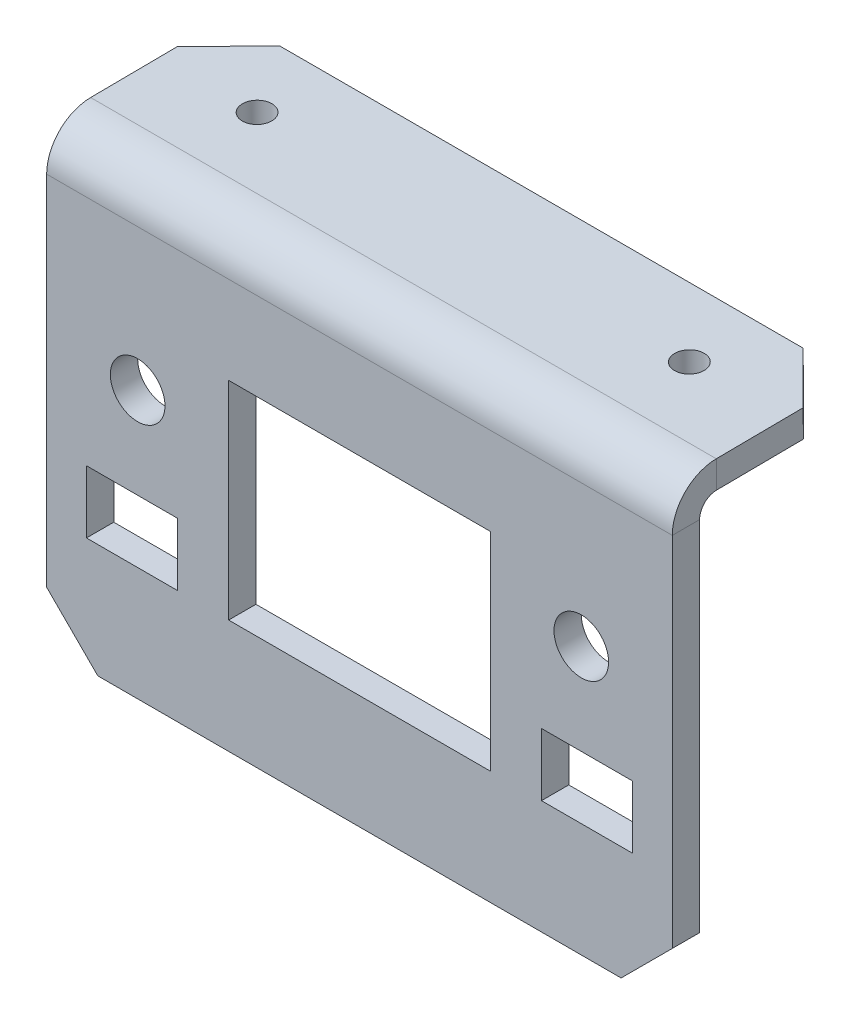
ISO-10303-21;
HEADER;
FILE_DESCRIPTION(('STEP AP214'),'2;1');
FILE_NAME('part.step','',(''),(''),'','','');
FILE_SCHEMA(('AUTOMOTIVE_DESIGN { 1 0 10303 214 1 1 1 1 }'));
ENDSEC;
DATA;
#1=APPLICATION_CONTEXT('core data for automotive mechanical design processes');
#2=APPLICATION_PROTOCOL_DEFINITION('international standard','automotive_design',2000,#1);
#3=PRODUCT_CONTEXT('',#1,'mechanical');
#4=PRODUCT('Part','Part','',(#3));
#5=PRODUCT_RELATED_PRODUCT_CATEGORY('part','',(#4));
#6=PRODUCT_DEFINITION_FORMATION('','',#4);
#7=PRODUCT_DEFINITION_CONTEXT('part definition',#1,'design');
#8=PRODUCT_DEFINITION('design','',#6,#7);
#9=PRODUCT_DEFINITION_SHAPE('','',#8);
#10=(LENGTH_UNIT() NAMED_UNIT(*) SI_UNIT(.MILLI.,.METRE.));
#11=(NAMED_UNIT(*) PLANE_ANGLE_UNIT() SI_UNIT($,.RADIAN.));
#12=(NAMED_UNIT(*) SI_UNIT($,.STERADIAN.) SOLID_ANGLE_UNIT());
#13=UNCERTAINTY_MEASURE_WITH_UNIT(LENGTH_MEASURE(1.E-05),#10,'distance_accuracy_value','');
#14=(GEOMETRIC_REPRESENTATION_CONTEXT(3) GLOBAL_UNCERTAINTY_ASSIGNED_CONTEXT((#13)) GLOBAL_UNIT_ASSIGNED_CONTEXT((#10,
#11,#12)) REPRESENTATION_CONTEXT('',''));
#15=CARTESIAN_POINT('',(0.,0.,0.));
#16=DIRECTION('',(0.,0.,1.));
#17=DIRECTION('',(1.,0.,0.));
#18=AXIS2_PLACEMENT_3D('',#15,#16,#17);
#19=CARTESIAN_POINT('',(0.,8.35779949302623,-8.128));
#20=DIRECTION('',(0.,0.00872653549837395,-0.999961923064171));
#21=DIRECTION('',(-1.,0.,0.));
#22=AXIS2_PLACEMENT_3D('',#19,#20,#21);
#23=PLANE('',#22);
#24=DIRECTION('',(1.,0.,0.));
#25=VECTOR('',#24,1.);
#26=CARTESIAN_POINT('',(0.,7.13864591642639,-8.13863939207961));
#27=LINE('',#26,#25);
#28=CARTESIAN_POINT('',(11.6836904988808,7.13864591642639,-8.13863939207961));
#29=VERTEX_POINT('',#28);
#30=CARTESIAN_POINT('',(-11.6836904988808,7.13864591642639,-8.13863939207961));
#31=VERTEX_POINT('',#30);
#32=EDGE_CURVE('E366',#29,#31,#27,.F.);
#33=ORIENTED_EDGE('',*,*,#32,.T.);
#34=DIRECTION('',(0.,0.999961923064171,0.00872653549837395));
#35=VECTOR('',#34,1.);
#36=CARTESIAN_POINT('',(-11.6836904988808,8.35779949302612,-8.128));
#37=LINE('',#36,#35);
#38=CARTESIAN_POINT('',(-11.6836904988808,8.35779949302612,-8.128));
#39=VERTEX_POINT('',#38);
#40=EDGE_CURVE('E279',#39,#31,#37,.F.);
#41=ORIENTED_EDGE('',*,*,#40,.F.);
#42=DIRECTION('',(-1.,0.,0.));
#43=VECTOR('',#42,1.);
#44=CARTESIAN_POINT('',(0.,8.35779949302623,-8.128));
#45=LINE('',#44,#43);
#46=CARTESIAN_POINT('',(11.6836904988808,8.35779949302623,-8.128));
#47=VERTEX_POINT('',#46);
#48=EDGE_CURVE('E341',#47,#39,#45,.T.);
#49=ORIENTED_EDGE('',*,*,#48,.F.);
#50=DIRECTION('',(0.,-0.999961923064171,-0.00872653549837395));
#51=VECTOR('',#50,1.);
#52=CARTESIAN_POINT('',(11.6836904988808,7.13864591642639,-8.13863939207961));
#53=LINE('',#52,#51);
#54=EDGE_CURVE('E320',#29,#47,#53,.F.);
#55=ORIENTED_EDGE('',*,*,#54,.F.);
#56=EDGE_LOOP('',(#33,#41,#49,#55));
#57=FACE_BOUND('',#56,.T.);
#58=ADVANCED_FACE('F49',(#57),#23,.T.);
#59=CARTESIAN_POINT('',(0.,8.3312,-5.08));
#60=DIRECTION('',(0.,0.999961923064171,0.00872653549837395));
#61=DIRECTION('',(0.,-0.00872653549837395,0.999961923064171));
#62=AXIS2_PLACEMENT_3D('',#59,#60,#61);
#63=PLANE('',#62);
#64=ORIENTED_EDGE('',*,*,#48,.T.);
#65=DIRECTION('',(0.707106781186545,0.00617059242716529,-0.707079856727018));
#66=VECTOR('',#65,1.);
#67=CARTESIAN_POINT('',(-9.88763927466694,8.37347279779112,-9.92398283608662));
#68=LINE('',#67,#66);
#69=CARTESIAN_POINT('',(-13.97,8.33784793200444,-5.8417775545409));
#70=VERTEX_POINT('',#69);
#71=EDGE_CURVE('E284',#70,#39,#68,.T.);
#72=ORIENTED_EDGE('',*,*,#71,.F.);
#73=DIRECTION('',(0.,-0.00872653549837395,0.999961923064171));
#74=VECTOR('',#73,1.);
#75=CARTESIAN_POINT('',(-13.97,8.33119999999999,-5.08));
#76=LINE('',#75,#74);
#77=CARTESIAN_POINT('',(-13.97,8.3040063031669,-1.96391098787062));
#78=VERTEX_POINT('',#77);
#79=EDGE_CURVE('E344',#70,#78,#76,.T.);
#80=ORIENTED_EDGE('',*,*,#79,.T.);
#81=DIRECTION('',(-1.,0.,0.));
#82=VECTOR('',#81,1.);
#83=CARTESIAN_POINT('',(13.97,8.30400630316691,-1.96391098787062));
#84=LINE('',#83,#82);
#85=CARTESIAN_POINT('',(13.97,8.30400630316691,-1.96391098787062));
#86=VERTEX_POINT('',#85);
#87=EDGE_CURVE('E349',#78,#86,#84,.F.);
#88=ORIENTED_EDGE('',*,*,#87,.T.);
#89=DIRECTION('',(0.,-0.00872653549837395,0.999961923064171));
#90=VECTOR('',#89,1.);
#91=CARTESIAN_POINT('',(13.97,8.35779746741042,-8.12776788741834));
#92=LINE('',#91,#90);
#93=CARTESIAN_POINT('',(13.97,8.33784793200444,-5.8417775545409));
#94=VERTEX_POINT('',#93);
#95=EDGE_CURVE('E339',#94,#86,#92,.T.);
#96=ORIENTED_EDGE('',*,*,#95,.F.);
#97=DIRECTION('',(-0.707106781186545,0.00617059242716528,-0.707079856727018));
#98=VECTOR('',#97,1.);
#99=CARTESIAN_POINT('',(7.36590328090028,8.39547881645836,-12.4456228098737));
#100=LINE('',#99,#98);
#101=EDGE_CURVE('E321',#94,#47,#100,.T.);
#102=ORIENTED_EDGE('',*,*,#101,.T.);
#103=EDGE_LOOP('',(#64,#72,#80,#88,#96,#102));
#104=FACE_BOUND('',#103,.T.);
#105=CARTESIAN_POINT('',(9.652,8.33119831195457,-5.079806569166));
#106=DIRECTION('',(0.,-0.999961923064171,-0.00872653549837395));
#107=DIRECTION('',(0.,0.00872653549837395,-0.999961923064171));
#108=AXIS2_PLACEMENT_3D('',#105,#106,#107);
#109=CIRCLE('',#108,0.6604);
#110=CARTESIAN_POINT('',(9.652,8.3369613159977,-5.74018142315758));
#111=VERTEX_POINT('',#110);
#112=EDGE_CURVE('E317',#111,#111,#109,.T.);
#113=ORIENTED_EDGE('',*,*,#112,.T.);
#114=EDGE_LOOP('',(#113));
#115=FACE_BOUND('',#114,.T.);
#116=CARTESIAN_POINT('',(-9.652,8.33119831195457,-5.079806569166));
#117=DIRECTION('',(0.,0.999961923064171,0.00872653549837395));
#118=DIRECTION('',(0.,0.00872653549837395,-0.999961923064171));
#119=AXIS2_PLACEMENT_3D('',#116,#117,#118);
#120=CIRCLE('',#119,0.6604);
#121=CARTESIAN_POINT('',(-9.652,8.3369613159977,-5.74018142315758));
#122=VERTEX_POINT('',#121);
#123=EDGE_CURVE('E276',#122,#122,#120,.T.);
#124=ORIENTED_EDGE('',*,*,#123,.F.);
#125=EDGE_LOOP('',(#124));
#126=FACE_BOUND('',#125,.T.);
#127=ADVANCED_FACE('F469',(#104,#115,#126),#63,.T.);
#128=CARTESIAN_POINT('',(0.,7.11204642340016,-5.09063939207962));
#129=DIRECTION('',(0.,0.999961923064171,0.00872653549837395));
#130=DIRECTION('',(0.,-0.00872653549837395,0.999961923064171));
#131=AXIS2_PLACEMENT_3D('',#128,#129,#130);
#132=PLANE('',#131);
#133=CARTESIAN_POINT('',(9.652,7.11204473535474,-5.09044596124562));
#134=DIRECTION('',(0.,-0.999961923064171,-0.00872653549837395));
#135=DIRECTION('',(0.,0.00872653549837395,-0.999961923064171));
#136=AXIS2_PLACEMENT_3D('',#133,#134,#135);
#137=CIRCLE('',#136,0.6604);
#138=CARTESIAN_POINT('',(9.652,7.11780773939786,-5.7508208152372));
#139=VERTEX_POINT('',#138);
#140=EDGE_CURVE('E313',#139,#139,#137,.T.);
#141=ORIENTED_EDGE('',*,*,#140,.F.);
#142=EDGE_LOOP('',(#141));
#143=FACE_BOUND('',#142,.T.);
#144=DIRECTION('',(0.707106781186545,0.00617059242716529,-0.707079856727018));
#145=VECTOR('',#144,1.);
#146=CARTESIAN_POINT('',(-9.88763927466694,7.15431922119128,-9.93462222816624));
#147=LINE('',#146,#145);
#148=CARTESIAN_POINT('',(-13.97,7.1186943554046,-5.85241694662052));
#149=VERTEX_POINT('',#148);
#150=EDGE_CURVE('E280',#149,#31,#147,.T.);
#151=ORIENTED_EDGE('',*,*,#150,.T.);
#152=ORIENTED_EDGE('',*,*,#32,.F.);
#153=DIRECTION('',(-0.707106781186545,0.00617059242716528,-0.707079856727018));
#154=VECTOR('',#153,1.);
#155=CARTESIAN_POINT('',(7.36590328090028,7.17632523985852,-12.4562622019533));
#156=LINE('',#155,#154);
#157=CARTESIAN_POINT('',(13.97,7.1186943554046,-5.85241694662052));
#158=VERTEX_POINT('',#157);
#159=EDGE_CURVE('E325',#158,#29,#156,.T.);
#160=ORIENTED_EDGE('',*,*,#159,.F.);
#161=DIRECTION('',(0.,-0.00872653549837395,0.999961923064171));
#162=VECTOR('',#161,1.);
#163=CARTESIAN_POINT('',(13.97,7.11204642340016,-5.09063939207962));
#164=LINE('',#163,#162);
#165=CARTESIAN_POINT('',(13.97,7.08485272656707,-1.97455037995024));
#166=VERTEX_POINT('',#165);
#167=EDGE_CURVE('E369',#158,#166,#164,.T.);
#168=ORIENTED_EDGE('',*,*,#167,.T.);
#169=DIRECTION('',(1.,0.,0.));
#170=VECTOR('',#169,1.);
#171=CARTESIAN_POINT('',(0.,7.08485272656707,-1.97455037995024));
#172=LINE('',#171,#170);
#173=CARTESIAN_POINT('',(-13.97,7.08485272656707,-1.97455037995024));
#174=VERTEX_POINT('',#173);
#175=EDGE_CURVE('E356',#174,#166,#172,.T.);
#176=ORIENTED_EDGE('',*,*,#175,.F.);
#177=DIRECTION('',(0.,-0.00872653549837395,0.999961923064171));
#178=VECTOR('',#177,1.);
#179=CARTESIAN_POINT('',(-13.97,7.11204642340016,-5.09063939207962));
#180=LINE('',#179,#178);
#181=EDGE_CURVE('E364',#149,#174,#180,.T.);
#182=ORIENTED_EDGE('',*,*,#181,.F.);
#183=EDGE_LOOP('',(#151,#152,#160,#168,#176,#182));
#184=FACE_BOUND('',#183,.T.);
#185=CARTESIAN_POINT('',(-9.652,7.11204473535474,-5.09044596124562));
#186=DIRECTION('',(0.,0.999961923064171,0.00872653549837395));
#187=DIRECTION('',(0.,-0.00872653549837395,0.999961923064171));
#188=AXIS2_PLACEMENT_3D('',#185,#186,#187);
#189=CIRCLE('',#188,0.6604);
#190=CARTESIAN_POINT('',(-9.652,7.10628173131161,-4.43007110725404));
#191=VERTEX_POINT('',#190);
#192=EDGE_CURVE('E272',#191,#191,#189,.T.);
#193=ORIENTED_EDGE('',*,*,#192,.T.);
#194=EDGE_LOOP('',(#193));
#195=FACE_BOUND('',#194,.T.);
#196=ADVANCED_FACE('F475',(#143,#184,#195),#132,.F.);
#197=CARTESIAN_POINT('',(-13.97,8.33119999999999,-5.08));
#198=DIRECTION('',(-1.,0.,0.));
#199=DIRECTION('',(0.,-0.00872653549837395,0.999961923064171));
#200=AXIS2_PLACEMENT_3D('',#197,#198,#199);
#201=PLANE('',#200);
#202=ORIENTED_EDGE('',*,*,#79,.F.);
#203=DIRECTION('',(0.,0.999961923064171,0.00872653549837395));
#204=VECTOR('',#203,1.);
#205=CARTESIAN_POINT('',(-13.97,8.33784793200444,-5.8417775545409));
#206=LINE('',#205,#204);
#207=EDGE_CURVE('E283',#70,#149,#206,.F.);
#208=ORIENTED_EDGE('',*,*,#207,.T.);
#209=ORIENTED_EDGE('',*,*,#181,.T.);
#210=DIRECTION('',(0.,0.999961923064171,0.00872653549837393));
#211=VECTOR('',#210,1.);
#212=CARTESIAN_POINT('',(-13.97,8.3040063031669,-1.96391098787062));
#213=LINE('',#212,#211);
#214=EDGE_CURVE('E352',#174,#78,#213,.T.);
#215=ORIENTED_EDGE('',*,*,#214,.T.);
#216=EDGE_LOOP('',(#202,#208,#209,#215));
#217=FACE_BOUND('',#216,.T.);
#218=ADVANCED_FACE('F480',(#217),#201,.T.);
#219=CARTESIAN_POINT('',(0.,0.,0.));
#220=DIRECTION('',(0.,0.,-1.));
#221=DIRECTION('',(-1.,0.,0.));
#222=AXIS2_PLACEMENT_3D('',#219,#220,#221);
#223=PLANE('',#222);
#224=DIRECTION('',(1.,0.,0.));
#225=VECTOR('',#224,1.);
#226=CARTESIAN_POINT('',(-5.842,-6.858,0.));
#227=LINE('',#226,#225);
#228=CARTESIAN_POINT('',(-5.842,-6.858,0.));
#229=VERTEX_POINT('',#228);
#230=CARTESIAN_POINT('',(5.842,-6.858,0.));
#231=VERTEX_POINT('',#230);
#232=EDGE_CURVE('E229',#229,#231,#227,.T.);
#233=ORIENTED_EDGE('',*,*,#232,.F.);
#234=DIRECTION('',(0.,-1.,0.));
#235=VECTOR('',#234,1.);
#236=CARTESIAN_POINT('',(-5.842,2.413,0.));
#237=LINE('',#236,#235);
#238=CARTESIAN_POINT('',(-5.842,2.413,0.));
#239=VERTEX_POINT('',#238);
#240=EDGE_CURVE('E234',#239,#229,#237,.T.);
#241=ORIENTED_EDGE('',*,*,#240,.F.);
#242=DIRECTION('',(-1.,0.,0.));
#243=VECTOR('',#242,1.);
#244=CARTESIAN_POINT('',(-5.842,2.413,0.));
#245=LINE('',#244,#243);
#246=CARTESIAN_POINT('',(5.842,2.413,0.));
#247=VERTEX_POINT('',#246);
#248=EDGE_CURVE('E239',#247,#239,#245,.T.);
#249=ORIENTED_EDGE('',*,*,#248,.F.);
#250=DIRECTION('',(0.,1.,0.));
#251=VECTOR('',#250,1.);
#252=CARTESIAN_POINT('',(5.842,2.413,0.));
#253=LINE('',#252,#251);
#254=EDGE_CURVE('E218',#231,#247,#253,.T.);
#255=ORIENTED_EDGE('',*,*,#254,.F.);
#256=EDGE_LOOP('',(#233,#241,#249,#255));
#257=FACE_BOUND('',#256,.T.);
#258=CARTESIAN_POINT('',(-9.906,0.,0.));
#259=DIRECTION('',(0.,0.,1.));
#260=DIRECTION('',(1.,0.,0.));
#261=AXIS2_PLACEMENT_3D('',#258,#259,#260);
#262=CIRCLE('',#261,1.2192);
#263=CARTESIAN_POINT('',(-8.6868,0.,0.));
#264=VERTEX_POINT('',#263);
#265=EDGE_CURVE('E249',#264,#264,#262,.T.);
#266=ORIENTED_EDGE('',*,*,#265,.F.);
#267=EDGE_LOOP('',(#266));
#268=FACE_BOUND('',#267,.T.);
#269=DIRECTION('',(0.,-1.,0.));
#270=VECTOR('',#269,1.);
#271=CARTESIAN_POINT('',(-12.192,-4.064,0.));
#272=LINE('',#271,#270);
#273=CARTESIAN_POINT('',(-12.192,-4.064,0.));
#274=VERTEX_POINT('',#273);
#275=CARTESIAN_POINT('',(-12.192,-6.858,0.));
#276=VERTEX_POINT('',#275);
#277=EDGE_CURVE('E261',#274,#276,#272,.T.);
#278=ORIENTED_EDGE('',*,*,#277,.F.);
#279=DIRECTION('',(-1.,0.,0.));
#280=VECTOR('',#279,1.);
#281=CARTESIAN_POINT('',(-8.128,-4.064,0.));
#282=LINE('',#281,#280);
#283=CARTESIAN_POINT('',(-8.128,-4.064,0.));
#284=VERTEX_POINT('',#283);
#285=EDGE_CURVE('E246',#284,#274,#282,.T.);
#286=ORIENTED_EDGE('',*,*,#285,.F.);
#287=DIRECTION('',(0.,1.,0.));
#288=VECTOR('',#287,1.);
#289=CARTESIAN_POINT('',(-8.128,-4.064,0.));
#290=LINE('',#289,#288);
#291=CARTESIAN_POINT('',(-8.128,-6.858,0.));
#292=VERTEX_POINT('',#291);
#293=EDGE_CURVE('E255',#292,#284,#290,.T.);
#294=ORIENTED_EDGE('',*,*,#293,.F.);
#295=DIRECTION('',(1.,0.,0.));
#296=VECTOR('',#295,1.);
#297=CARTESIAN_POINT('',(-8.128,-6.858,0.));
#298=LINE('',#297,#296);
#299=EDGE_CURVE('E258',#276,#292,#298,.T.);
#300=ORIENTED_EDGE('',*,*,#299,.F.);
#301=EDGE_LOOP('',(#278,#286,#294,#300));
#302=FACE_BOUND('',#301,.T.);
#303=DIRECTION('',(1.,0.,0.));
#304=VECTOR('',#303,1.);
#305=CARTESIAN_POINT('',(13.97,-11.938,0.));
#306=LINE('',#305,#304);
#307=CARTESIAN_POINT('',(-11.684,-11.938,0.));
#308=VERTEX_POINT('',#307);
#309=CARTESIAN_POINT('',(11.684,-11.938,0.));
#310=VERTEX_POINT('',#309);
#311=EDGE_CURVE('E336',#308,#310,#306,.T.);
#312=ORIENTED_EDGE('',*,*,#311,.T.);
#313=DIRECTION('',(-0.707106781186546,-0.707106781186549,0.));
#314=VECTOR('',#313,1.);
#315=CARTESIAN_POINT('',(11.684,-11.938,0.));
#316=LINE('',#315,#314);
#317=CARTESIAN_POINT('',(13.97,-9.65199999999999,0.));
#318=VERTEX_POINT('',#317);
#319=EDGE_CURVE('E432',#310,#318,#316,.F.);
#320=ORIENTED_EDGE('',*,*,#319,.T.);
#321=DIRECTION('',(0.,1.,0.));
#322=VECTOR('',#321,1.);
#323=CARTESIAN_POINT('',(13.97,8.3312,0.));
#324=LINE('',#323,#322);
#325=CARTESIAN_POINT('',(13.97,6.32288174119217,0.));
#326=VERTEX_POINT('',#325);
#327=EDGE_CURVE('E330',#318,#326,#324,.T.);
#328=ORIENTED_EDGE('',*,*,#327,.T.);
#329=DIRECTION('',(-1.,0.,0.));
#330=VECTOR('',#329,1.);
#331=CARTESIAN_POINT('',(-13.97,6.32288174119217,0.));
#332=LINE('',#331,#330);
#333=CARTESIAN_POINT('',(-13.97,6.32288174119217,0.));
#334=VERTEX_POINT('',#333);
#335=EDGE_CURVE('E346',#326,#334,#332,.T.);
#336=ORIENTED_EDGE('',*,*,#335,.T.);
#337=DIRECTION('',(0.,-1.,0.));
#338=VECTOR('',#337,1.);
#339=CARTESIAN_POINT('',(-13.97,8.33119999999999,0.));
#340=LINE('',#339,#338);
#341=CARTESIAN_POINT('',(-13.97,-9.65199999999999,0.));
#342=VERTEX_POINT('',#341);
#343=EDGE_CURVE('E332',#334,#342,#340,.T.);
#344=ORIENTED_EDGE('',*,*,#343,.T.);
#345=DIRECTION('',(-0.707106781186548,0.707106781186547,0.));
#346=VECTOR('',#345,1.);
#347=CARTESIAN_POINT('',(-13.97,-9.65199999999999,0.));
#348=LINE('',#347,#346);
#349=EDGE_CURVE('E430',#342,#308,#348,.F.);
#350=ORIENTED_EDGE('',*,*,#349,.T.);
#351=EDGE_LOOP('',(#312,#320,#328,#336,#344,#350));
#352=FACE_BOUND('',#351,.T.);
#353=DIRECTION('',(1.,0.,0.));
#354=VECTOR('',#353,1.);
#355=CARTESIAN_POINT('',(8.128,-4.064,0.));
#356=LINE('',#355,#354);
#357=CARTESIAN_POINT('',(8.128,-4.064,0.));
#358=VERTEX_POINT('',#357);
#359=CARTESIAN_POINT('',(12.192,-4.064,0.));
#360=VERTEX_POINT('',#359);
#361=EDGE_CURVE('E275',#358,#360,#356,.T.);
#362=ORIENTED_EDGE('',*,*,#361,.T.);
#363=DIRECTION('',(0.,-1.,0.));
#364=VECTOR('',#363,1.);
#365=CARTESIAN_POINT('',(12.192,-4.064,0.));
#366=LINE('',#365,#364);
#367=CARTESIAN_POINT('',(12.192,-6.858,0.));
#368=VERTEX_POINT('',#367);
#369=EDGE_CURVE('E296',#360,#368,#366,.T.);
#370=ORIENTED_EDGE('',*,*,#369,.T.);
#371=DIRECTION('',(-1.,0.,0.));
#372=VECTOR('',#371,1.);
#373=CARTESIAN_POINT('',(8.128,-6.858,0.));
#374=LINE('',#373,#372);
#375=CARTESIAN_POINT('',(8.128,-6.858,0.));
#376=VERTEX_POINT('',#375);
#377=EDGE_CURVE('E299',#368,#376,#374,.T.);
#378=ORIENTED_EDGE('',*,*,#377,.T.);
#379=DIRECTION('',(0.,1.,0.));
#380=VECTOR('',#379,1.);
#381=CARTESIAN_POINT('',(8.128,-4.064,0.));
#382=LINE('',#381,#380);
#383=EDGE_CURVE('E302',#376,#358,#382,.T.);
#384=ORIENTED_EDGE('',*,*,#383,.T.);
#385=EDGE_LOOP('',(#362,#370,#378,#384));
#386=FACE_BOUND('',#385,.T.);
#387=CARTESIAN_POINT('',(9.906,0.,0.));
#388=DIRECTION('',(0.,0.,-1.));
#389=DIRECTION('',(-1.,0.,0.));
#390=AXIS2_PLACEMENT_3D('',#387,#388,#389);
#391=CIRCLE('',#390,1.2192);
#392=CARTESIAN_POINT('',(8.6868,0.,0.));
#393=VERTEX_POINT('',#392);
#394=EDGE_CURVE('E289',#393,#393,#391,.T.);
#395=ORIENTED_EDGE('',*,*,#394,.T.);
#396=EDGE_LOOP('',(#395));
#397=FACE_BOUND('',#396,.T.);
#398=ADVANCED_FACE('F236',(#257,#268,#302,#352,#386,#397),#223,.F.);
#399=CARTESIAN_POINT('',(0.,0.,-1.2192));
#400=DIRECTION('',(0.,0.,-1.));
#401=DIRECTION('',(-1.,0.,0.));
#402=AXIS2_PLACEMENT_3D('',#399,#400,#401);
#403=PLANE('',#402);
#404=DIRECTION('',(0.,1.,0.));
#405=VECTOR('',#404,1.);
#406=CARTESIAN_POINT('',(-5.842,0.,-1.2192));
#407=LINE('',#406,#405);
#408=CARTESIAN_POINT('',(-5.842,-6.858,-1.2192));
#409=VERTEX_POINT('',#408);
#410=CARTESIAN_POINT('',(-5.842,2.413,-1.2192));
#411=VERTEX_POINT('',#410);
#412=EDGE_CURVE('E423',#409,#411,#407,.T.);
#413=ORIENTED_EDGE('',*,*,#412,.F.);
#414=DIRECTION('',(-1.,0.,0.));
#415=VECTOR('',#414,1.);
#416=CARTESIAN_POINT('',(0.,-6.858,-1.2192));
#417=LINE('',#416,#415);
#418=CARTESIAN_POINT('',(5.842,-6.858,-1.2192));
#419=VERTEX_POINT('',#418);
#420=EDGE_CURVE('E416',#419,#409,#417,.T.);
#421=ORIENTED_EDGE('',*,*,#420,.F.);
#422=DIRECTION('',(0.,-1.,0.));
#423=VECTOR('',#422,1.);
#424=CARTESIAN_POINT('',(5.842,0.,-1.2192));
#425=LINE('',#424,#423);
#426=CARTESIAN_POINT('',(5.842,2.413,-1.2192));
#427=VERTEX_POINT('',#426);
#428=EDGE_CURVE('E221',#427,#419,#425,.T.);
#429=ORIENTED_EDGE('',*,*,#428,.F.);
#430=DIRECTION('',(1.,0.,0.));
#431=VECTOR('',#430,1.);
#432=CARTESIAN_POINT('',(0.,2.413,-1.2192));
#433=LINE('',#432,#431);
#434=EDGE_CURVE('E421',#411,#427,#433,.T.);
#435=ORIENTED_EDGE('',*,*,#434,.F.);
#436=EDGE_LOOP('',(#413,#421,#429,#435));
#437=FACE_BOUND('',#436,.T.);
#438=CARTESIAN_POINT('',(-9.906,0.,-1.2192));
#439=DIRECTION('',(0.,0.,-1.));
#440=DIRECTION('',(-1.,0.,0.));
#441=AXIS2_PLACEMENT_3D('',#438,#439,#440);
#442=CIRCLE('',#441,1.2192);
#443=CARTESIAN_POINT('',(-11.1252,0.,-1.2192));
#444=VERTEX_POINT('',#443);
#445=EDGE_CURVE('E252',#444,#444,#442,.T.);
#446=ORIENTED_EDGE('',*,*,#445,.F.);
#447=EDGE_LOOP('',(#446));
#448=FACE_BOUND('',#447,.T.);
#449=DIRECTION('',(1.,0.,0.));
#450=VECTOR('',#449,1.);
#451=CARTESIAN_POINT('',(0.,-4.064,-1.2192));
#452=LINE('',#451,#450);
#453=CARTESIAN_POINT('',(-12.192,-4.064,-1.2192));
#454=VERTEX_POINT('',#453);
#455=CARTESIAN_POINT('',(-8.128,-4.064,-1.2192));
#456=VERTEX_POINT('',#455);
#457=EDGE_CURVE('E414',#454,#456,#452,.T.);
#458=ORIENTED_EDGE('',*,*,#457,.F.);
#459=DIRECTION('',(0.,1.,0.));
#460=VECTOR('',#459,1.);
#461=CARTESIAN_POINT('',(-12.192,0.,-1.2192));
#462=LINE('',#461,#460);
#463=CARTESIAN_POINT('',(-12.192,-6.858,-1.2192));
#464=VERTEX_POINT('',#463);
#465=EDGE_CURVE('E405',#464,#454,#462,.T.);
#466=ORIENTED_EDGE('',*,*,#465,.F.);
#467=DIRECTION('',(-1.,0.,0.));
#468=VECTOR('',#467,1.);
#469=CARTESIAN_POINT('',(0.,-6.858,-1.2192));
#470=LINE('',#469,#468);
#471=CARTESIAN_POINT('',(-8.128,-6.858,-1.2192));
#472=VERTEX_POINT('',#471);
#473=EDGE_CURVE('E409',#472,#464,#470,.T.);
#474=ORIENTED_EDGE('',*,*,#473,.F.);
#475=DIRECTION('',(0.,-1.,0.));
#476=VECTOR('',#475,1.);
#477=CARTESIAN_POINT('',(-8.128,0.,-1.2192));
#478=LINE('',#477,#476);
#479=EDGE_CURVE('E412',#456,#472,#478,.T.);
#480=ORIENTED_EDGE('',*,*,#479,.F.);
#481=EDGE_LOOP('',(#458,#466,#474,#480));
#482=FACE_BOUND('',#481,.T.);
#483=DIRECTION('',(0.,1.,0.));
#484=VECTOR('',#483,1.);
#485=CARTESIAN_POINT('',(12.192,0.,-1.2192));
#486=LINE('',#485,#484);
#487=CARTESIAN_POINT('',(12.192,-6.858,-1.2192));
#488=VERTEX_POINT('',#487);
#489=CARTESIAN_POINT('',(12.192,-4.064,-1.2192));
#490=VERTEX_POINT('',#489);
#491=EDGE_CURVE('E399',#488,#490,#486,.T.);
#492=ORIENTED_EDGE('',*,*,#491,.T.);
#493=DIRECTION('',(-1.,0.,0.));
#494=VECTOR('',#493,1.);
#495=CARTESIAN_POINT('',(0.,-4.064,-1.2192));
#496=LINE('',#495,#494);
#497=CARTESIAN_POINT('',(8.128,-4.064,-1.2192));
#498=VERTEX_POINT('',#497);
#499=EDGE_CURVE('E402',#490,#498,#496,.T.);
#500=ORIENTED_EDGE('',*,*,#499,.T.);
#501=DIRECTION('',(0.,-1.,0.));
#502=VECTOR('',#501,1.);
#503=CARTESIAN_POINT('',(8.128,0.,-1.2192));
#504=LINE('',#503,#502);
#505=CARTESIAN_POINT('',(8.128,-6.858,-1.2192));
#506=VERTEX_POINT('',#505);
#507=EDGE_CURVE('E391',#498,#506,#504,.T.);
#508=ORIENTED_EDGE('',*,*,#507,.T.);
#509=DIRECTION('',(1.,0.,0.));
#510=VECTOR('',#509,1.);
#511=CARTESIAN_POINT('',(0.,-6.858,-1.2192));
#512=LINE('',#511,#510);
#513=EDGE_CURVE('E396',#506,#488,#512,.T.);
#514=ORIENTED_EDGE('',*,*,#513,.T.);
#515=EDGE_LOOP('',(#492,#500,#508,#514));
#516=FACE_BOUND('',#515,.T.);
#517=DIRECTION('',(0.,1.,0.));
#518=VECTOR('',#517,1.);
#519=CARTESIAN_POINT('',(13.97,0.,-1.2192));
#520=LINE('',#519,#518);
#521=CARTESIAN_POINT('',(13.97,-9.65199999999999,-1.2192));
#522=VERTEX_POINT('',#521);
#523=CARTESIAN_POINT('',(13.97,6.32288174119217,-1.2192));
#524=VERTEX_POINT('',#523);
#525=EDGE_CURVE('E375',#522,#524,#520,.T.);
#526=ORIENTED_EDGE('',*,*,#525,.F.);
#527=DIRECTION('',(0.707106781186546,0.707106781186549,0.));
#528=VECTOR('',#527,1.);
#529=CARTESIAN_POINT('',(11.811,-11.811,-1.2192));
#530=LINE('',#529,#528);
#531=CARTESIAN_POINT('',(11.684,-11.938,-1.2192));
#532=VERTEX_POINT('',#531);
#533=EDGE_CURVE('E57',#522,#532,#530,.F.);
#534=ORIENTED_EDGE('',*,*,#533,.T.);
#535=DIRECTION('',(-1.,0.,0.));
#536=VECTOR('',#535,1.);
#537=CARTESIAN_POINT('',(0.,-11.938,-1.2192));
#538=LINE('',#537,#536);
#539=CARTESIAN_POINT('',(-11.684,-11.938,-1.2192));
#540=VERTEX_POINT('',#539);
#541=EDGE_CURVE('E371',#540,#532,#538,.F.);
#542=ORIENTED_EDGE('',*,*,#541,.F.);
#543=DIRECTION('',(0.707106781186548,-0.707106781186547,0.));
#544=VECTOR('',#543,1.);
#545=CARTESIAN_POINT('',(-11.811,-11.811,-1.2192));
#546=LINE('',#545,#544);
#547=CARTESIAN_POINT('',(-13.97,-9.65199999999999,-1.2192));
#548=VERTEX_POINT('',#547);
#549=EDGE_CURVE('E64',#540,#548,#546,.F.);
#550=ORIENTED_EDGE('',*,*,#549,.T.);
#551=DIRECTION('',(0.,1.,0.));
#552=VECTOR('',#551,1.);
#553=CARTESIAN_POINT('',(-13.97,0.,-1.2192));
#554=LINE('',#553,#552);
#555=CARTESIAN_POINT('',(-13.97,6.32288174119217,-1.2192));
#556=VERTEX_POINT('',#555);
#557=EDGE_CURVE('E377',#556,#548,#554,.F.);
#558=ORIENTED_EDGE('',*,*,#557,.F.);
#559=DIRECTION('',(-1.,0.,0.));
#560=VECTOR('',#559,1.);
#561=CARTESIAN_POINT('',(0.,6.32288174119217,-1.2192));
#562=LINE('',#561,#560);
#563=EDGE_CURVE('E361',#524,#556,#562,.T.);
#564=ORIENTED_EDGE('',*,*,#563,.F.);
#565=EDGE_LOOP('',(#526,#534,#542,#550,#558,#564));
#566=FACE_BOUND('',#565,.T.);
#567=CARTESIAN_POINT('',(9.906,0.,-1.2192));
#568=DIRECTION('',(0.,0.,-1.));
#569=DIRECTION('',(-1.,0.,0.));
#570=AXIS2_PLACEMENT_3D('',#567,#568,#569);
#571=CIRCLE('',#570,1.2192);
#572=CARTESIAN_POINT('',(8.6868,0.,-1.2192));
#573=VERTEX_POINT('',#572);
#574=EDGE_CURVE('E292',#573,#573,#571,.F.);
#575=ORIENTED_EDGE('',*,*,#574,.T.);
#576=EDGE_LOOP('',(#575));
#577=FACE_BOUND('',#576,.T.);
#578=ADVANCED_FACE('F436',(#437,#448,#482,#516,#566,#577),#403,.T.);
#579=CARTESIAN_POINT('',(13.97,8.35779746741042,-8.12776788741834));
#580=DIRECTION('',(-1.,0.,0.));
#581=DIRECTION('',(0.,-0.00872653549837395,0.999961923064171));
#582=AXIS2_PLACEMENT_3D('',#579,#580,#581);
#583=PLANE('',#582);
#584=ORIENTED_EDGE('',*,*,#167,.F.);
#585=DIRECTION('',(0.,-0.999961923064171,-0.00872653549837395));
#586=VECTOR('',#585,1.);
#587=CARTESIAN_POINT('',(13.97,7.1186943554046,-5.85241694662052));
#588=LINE('',#587,#586);
#589=EDGE_CURVE('E324',#158,#94,#588,.F.);
#590=ORIENTED_EDGE('',*,*,#589,.T.);
#591=ORIENTED_EDGE('',*,*,#95,.T.);
#592=DIRECTION('',(0.,0.999961923064171,0.00872653549837395));
#593=VECTOR('',#592,1.);
#594=CARTESIAN_POINT('',(13.97,8.30400630316691,-1.96391098787062));
#595=LINE('',#594,#593);
#596=EDGE_CURVE('E383',#166,#86,#595,.T.);
#597=ORIENTED_EDGE('',*,*,#596,.F.);
#598=EDGE_LOOP('',(#584,#590,#591,#597));
#599=FACE_BOUND('',#598,.T.);
#600=ADVANCED_FACE('F482',(#599),#583,.F.);
#601=CARTESIAN_POINT('',(-13.97,8.33119999999999,0.));
#602=DIRECTION('',(1.,0.,0.));
#603=DIRECTION('',(0.,-1.,0.));
#604=AXIS2_PLACEMENT_3D('',#601,#602,#603);
#605=PLANE('',#604);
#606=ORIENTED_EDGE('',*,*,#557,.T.);
#607=DIRECTION('',(0.,0.,-1.));
#608=VECTOR('',#607,1.);
#609=CARTESIAN_POINT('',(-13.97,-9.65199999999999,0.));
#610=LINE('',#609,#608);
#611=EDGE_CURVE('E13',#548,#342,#610,.F.);
#612=ORIENTED_EDGE('',*,*,#611,.T.);
#613=ORIENTED_EDGE('',*,*,#343,.F.);
#614=DIRECTION('',(0.,0.,1.));
#615=VECTOR('',#614,1.);
#616=CARTESIAN_POINT('',(-13.97,6.32288174119217,0.));
#617=LINE('',#616,#615);
#618=EDGE_CURVE('E389',#556,#334,#617,.T.);
#619=ORIENTED_EDGE('',*,*,#618,.F.);
#620=EDGE_LOOP('',(#606,#612,#613,#619));
#621=FACE_BOUND('',#620,.T.);
#622=ADVANCED_FACE('F461',(#621),#605,.F.);
#623=CARTESIAN_POINT('',(13.97,-11.938,0.));
#624=DIRECTION('',(0.,1.,0.));
#625=DIRECTION('',(1.,0.,0.));
#626=AXIS2_PLACEMENT_3D('',#623,#624,#625);
#627=PLANE('',#626);
#628=ORIENTED_EDGE('',*,*,#541,.T.);
#629=DIRECTION('',(0.,0.,-1.));
#630=VECTOR('',#629,1.);
#631=CARTESIAN_POINT('',(11.684,-11.938,0.));
#632=LINE('',#631,#630);
#633=EDGE_CURVE('E427',#532,#310,#632,.F.);
#634=ORIENTED_EDGE('',*,*,#633,.T.);
#635=ORIENTED_EDGE('',*,*,#311,.F.);
#636=DIRECTION('',(0.,0.,1.));
#637=VECTOR('',#636,1.);
#638=CARTESIAN_POINT('',(-11.684,-11.938,0.));
#639=LINE('',#638,#637);
#640=EDGE_CURVE('E425',#308,#540,#639,.F.);
#641=ORIENTED_EDGE('',*,*,#640,.T.);
#642=EDGE_LOOP('',(#628,#634,#635,#641));
#643=FACE_BOUND('',#642,.T.);
#644=ADVANCED_FACE('F442',(#643),#627,.F.);
#645=CARTESIAN_POINT('',(13.97,8.3312,0.));
#646=DIRECTION('',(-1.,0.,0.));
#647=DIRECTION('',(0.,1.,0.));
#648=AXIS2_PLACEMENT_3D('',#645,#646,#647);
#649=PLANE('',#648);
#650=ORIENTED_EDGE('',*,*,#327,.F.);
#651=DIRECTION('',(0.,0.,1.));
#652=VECTOR('',#651,1.);
#653=CARTESIAN_POINT('',(13.97,-9.65199999999999,0.));
#654=LINE('',#653,#652);
#655=EDGE_CURVE('E72',#318,#522,#654,.F.);
#656=ORIENTED_EDGE('',*,*,#655,.T.);
#657=ORIENTED_EDGE('',*,*,#525,.T.);
#658=DIRECTION('',(0.,0.,1.));
#659=VECTOR('',#658,1.);
#660=CARTESIAN_POINT('',(13.97,6.32288174119217,0.));
#661=LINE('',#660,#659);
#662=EDGE_CURVE('E386',#524,#326,#661,.T.);
#663=ORIENTED_EDGE('',*,*,#662,.T.);
#664=EDGE_LOOP('',(#650,#656,#657,#663));
#665=FACE_BOUND('',#664,.T.);
#666=ADVANCED_FACE('F448',(#665),#649,.F.);
#667=CARTESIAN_POINT('',(13.97,6.32288174119217,-1.9812));
#668=DIRECTION('',(1.,0.,0.));
#669=DIRECTION('',(0.,1.,0.));
#670=AXIS2_PLACEMENT_3D('',#667,#668,#669);
#671=PLANE('',#670);
#672=ORIENTED_EDGE('',*,*,#662,.F.);
#673=CARTESIAN_POINT('',(13.97,6.32288174119217,-1.9812));
#674=DIRECTION('',(1.,0.,0.));
#675=DIRECTION('',(0.,1.,0.));
#676=AXIS2_PLACEMENT_3D('',#673,#674,#675);
#677=CIRCLE('',#676,0.762);
#678=EDGE_CURVE('E372',#524,#166,#677,.F.);
#679=ORIENTED_EDGE('',*,*,#678,.T.);
#680=ORIENTED_EDGE('',*,*,#596,.T.);
#681=CARTESIAN_POINT('',(13.97,6.32288174119217,-1.9812));
#682=DIRECTION('',(-1.,0.,0.));
#683=DIRECTION('',(0.,-1.,0.));
#684=AXIS2_PLACEMENT_3D('',#681,#682,#683);
#685=CIRCLE('',#684,1.9812);
#686=EDGE_CURVE('E333',#326,#86,#685,.T.);
#687=ORIENTED_EDGE('',*,*,#686,.F.);
#688=EDGE_LOOP('',(#672,#679,#680,#687));
#689=FACE_BOUND('',#688,.T.);
#690=ADVANCED_FACE('F453',(#689),#671,.T.);
#691=CARTESIAN_POINT('',(-13.97,6.32288174119217,-1.9812));
#692=DIRECTION('',(1.,0.,0.));
#693=DIRECTION('',(0.,1.,0.));
#694=AXIS2_PLACEMENT_3D('',#691,#692,#693);
#695=PLANE('',#694);
#696=CARTESIAN_POINT('',(-13.97,6.32288174119217,-1.9812));
#697=DIRECTION('',(1.,0.,0.));
#698=DIRECTION('',(0.,1.,0.));
#699=AXIS2_PLACEMENT_3D('',#696,#697,#698);
#700=CIRCLE('',#699,0.762);
#701=EDGE_CURVE('E316',#174,#556,#700,.T.);
#702=ORIENTED_EDGE('',*,*,#701,.T.);
#703=ORIENTED_EDGE('',*,*,#618,.T.);
#704=CARTESIAN_POINT('',(-13.97,6.32288174119217,-1.9812));
#705=DIRECTION('',(-1.,0.,0.));
#706=DIRECTION('',(0.,-1.,0.));
#707=AXIS2_PLACEMENT_3D('',#704,#705,#706);
#708=CIRCLE('',#707,1.9812);
#709=EDGE_CURVE('E353',#78,#334,#708,.F.);
#710=ORIENTED_EDGE('',*,*,#709,.F.);
#711=ORIENTED_EDGE('',*,*,#214,.F.);
#712=EDGE_LOOP('',(#702,#703,#710,#711));
#713=FACE_BOUND('',#712,.T.);
#714=ADVANCED_FACE('F488',(#713),#695,.F.);
#715=CARTESIAN_POINT('',(0.,6.32288174119217,-1.9812));
#716=DIRECTION('',(1.,0.,0.));
#717=DIRECTION('',(0.,1.,0.));
#718=AXIS2_PLACEMENT_3D('',#715,#716,#717);
#719=CYLINDRICAL_SURFACE('',#718,1.9812);
#720=ORIENTED_EDGE('',*,*,#686,.T.);
#721=ORIENTED_EDGE('',*,*,#87,.F.);
#722=ORIENTED_EDGE('',*,*,#709,.T.);
#723=ORIENTED_EDGE('',*,*,#335,.F.);
#724=EDGE_LOOP('',(#720,#721,#722,#723));
#725=FACE_BOUND('',#724,.T.);
#726=ADVANCED_FACE('F457',(#725),#719,.T.);
#727=CARTESIAN_POINT('',(0.,6.32288174119217,-1.9812));
#728=DIRECTION('',(1.,0.,0.));
#729=DIRECTION('',(0.,1.,0.));
#730=AXIS2_PLACEMENT_3D('',#727,#728,#729);
#731=CYLINDRICAL_SURFACE('',#730,0.762);
#732=ORIENTED_EDGE('',*,*,#678,.F.);
#733=ORIENTED_EDGE('',*,*,#563,.T.);
#734=ORIENTED_EDGE('',*,*,#701,.F.);
#735=ORIENTED_EDGE('',*,*,#175,.T.);
#736=EDGE_LOOP('',(#732,#733,#734,#735));
#737=FACE_BOUND('',#736,.T.);
#738=ADVANCED_FACE('F500',(#737),#731,.F.);
#739=CARTESIAN_POINT('',(7.36590328090028,7.17632523985852,-12.4562622019533));
#740=DIRECTION('',(0.70710678118655,0.00617059242716542,-0.707079856727014));
#741=DIRECTION('',(-0.707106781186545,0.00617059242716528,-0.707079856727018));
#742=AXIS2_PLACEMENT_3D('',#739,#740,#741);
#743=PLANE('',#742);
#744=ORIENTED_EDGE('',*,*,#159,.T.);
#745=ORIENTED_EDGE('',*,*,#54,.T.);
#746=ORIENTED_EDGE('',*,*,#101,.F.);
#747=ORIENTED_EDGE('',*,*,#589,.F.);
#748=EDGE_LOOP('',(#744,#745,#746,#747));
#749=FACE_BOUND('',#748,.T.);
#750=ADVANCED_FACE('F524',(#749),#743,.T.);
#751=CARTESIAN_POINT('',(9.652,8.33119831195457,-5.079806569166));
#752=DIRECTION('',(0.,0.999961923064171,0.00872653549837395));
#753=DIRECTION('',(0.,-0.00872653549837395,0.999961923064171));
#754=AXIS2_PLACEMENT_3D('',#751,#752,#753);
#755=CYLINDRICAL_SURFACE('',#754,0.6604);
#756=ORIENTED_EDGE('',*,*,#140,.T.);
#757=EDGE_LOOP('',(#756));
#758=FACE_BOUND('',#757,.T.);
#759=ORIENTED_EDGE('',*,*,#112,.F.);
#760=EDGE_LOOP('',(#759));
#761=FACE_BOUND('',#760,.T.);
#762=ADVANCED_FACE('F526',(#758,#761),#755,.F.);
#763=CARTESIAN_POINT('',(8.128,-4.064,-8.13863939207961));
#764=DIRECTION('',(0.,-1.,0.));
#765=DIRECTION('',(0.,0.,-1.));
#766=AXIS2_PLACEMENT_3D('',#763,#764,#765);
#767=PLANE('',#766);
#768=DIRECTION('',(0.,0.,1.));
#769=VECTOR('',#768,1.);
#770=CARTESIAN_POINT('',(12.192,-4.064,-8.13863939207961));
#771=LINE('',#770,#769);
#772=EDGE_CURVE('E293',#490,#360,#771,.T.);
#773=ORIENTED_EDGE('',*,*,#772,.T.);
#774=ORIENTED_EDGE('',*,*,#361,.F.);
#775=DIRECTION('',(0.,0.,1.));
#776=VECTOR('',#775,1.);
#777=CARTESIAN_POINT('',(8.128,-4.064,-8.13863939207961));
#778=LINE('',#777,#776);
#779=EDGE_CURVE('E305',#498,#358,#778,.T.);
#780=ORIENTED_EDGE('',*,*,#779,.F.);
#781=ORIENTED_EDGE('',*,*,#499,.F.);
#782=EDGE_LOOP('',(#773,#774,#780,#781));
#783=FACE_BOUND('',#782,.T.);
#784=ADVANCED_FACE('F532',(#783),#767,.T.);
#785=CARTESIAN_POINT('',(12.192,-4.064,-8.13863939207961));
#786=DIRECTION('',(-1.,0.,0.));
#787=DIRECTION('',(0.,-1.,0.));
#788=AXIS2_PLACEMENT_3D('',#785,#786,#787);
#789=PLANE('',#788);
#790=DIRECTION('',(0.,0.,1.));
#791=VECTOR('',#790,1.);
#792=CARTESIAN_POINT('',(12.192,-6.858,-8.13863939207961));
#793=LINE('',#792,#791);
#794=EDGE_CURVE('E310',#488,#368,#793,.T.);
#795=ORIENTED_EDGE('',*,*,#794,.T.);
#796=ORIENTED_EDGE('',*,*,#369,.F.);
#797=ORIENTED_EDGE('',*,*,#772,.F.);
#798=ORIENTED_EDGE('',*,*,#491,.F.);
#799=EDGE_LOOP('',(#795,#796,#797,#798));
#800=FACE_BOUND('',#799,.T.);
#801=ADVANCED_FACE('F559',(#800),#789,.T.);
#802=CARTESIAN_POINT('',(8.128,-6.858,-8.13863939207961));
#803=DIRECTION('',(0.,1.,0.));
#804=DIRECTION('',(0.,0.,1.));
#805=AXIS2_PLACEMENT_3D('',#802,#803,#804);
#806=PLANE('',#805);
#807=DIRECTION('',(0.,0.,1.));
#808=VECTOR('',#807,1.);
#809=CARTESIAN_POINT('',(8.128,-6.858,-8.13863939207961));
#810=LINE('',#809,#808);
#811=EDGE_CURVE('E308',#506,#376,#810,.T.);
#812=ORIENTED_EDGE('',*,*,#811,.T.);
#813=ORIENTED_EDGE('',*,*,#377,.F.);
#814=ORIENTED_EDGE('',*,*,#794,.F.);
#815=ORIENTED_EDGE('',*,*,#513,.F.);
#816=EDGE_LOOP('',(#812,#813,#814,#815));
#817=FACE_BOUND('',#816,.T.);
#818=ADVANCED_FACE('F563',(#817),#806,.T.);
#819=CARTESIAN_POINT('',(8.128,-4.064,-8.13863939207961));
#820=DIRECTION('',(1.,0.,0.));
#821=DIRECTION('',(0.,0.,-1.));
#822=AXIS2_PLACEMENT_3D('',#819,#820,#821);
#823=PLANE('',#822);
#824=ORIENTED_EDGE('',*,*,#779,.T.);
#825=ORIENTED_EDGE('',*,*,#383,.F.);
#826=ORIENTED_EDGE('',*,*,#811,.F.);
#827=ORIENTED_EDGE('',*,*,#507,.F.);
#828=EDGE_LOOP('',(#824,#825,#826,#827));
#829=FACE_BOUND('',#828,.T.);
#830=ADVANCED_FACE('F569',(#829),#823,.T.);
#831=CARTESIAN_POINT('',(9.906,0.,-8.13863939207961));
#832=DIRECTION('',(0.,0.,1.));
#833=DIRECTION('',(1.,0.,0.));
#834=AXIS2_PLACEMENT_3D('',#831,#832,#833);
#835=CYLINDRICAL_SURFACE('',#834,1.2192);
#836=ORIENTED_EDGE('',*,*,#574,.F.);
#837=EDGE_LOOP('',(#836));
#838=FACE_BOUND('',#837,.T.);
#839=ORIENTED_EDGE('',*,*,#394,.F.);
#840=EDGE_LOOP('',(#839));
#841=FACE_BOUND('',#840,.T.);
#842=ADVANCED_FACE('F571',(#838,#841),#835,.F.);
#843=CARTESIAN_POINT('',(-9.88763927466694,8.37347279779112,-9.92398283608662));
#844=DIRECTION('',(0.70710678118655,-0.00617059242716524,0.707079856727014));
#845=DIRECTION('',(0.707106781186545,0.00617059242716529,-0.707079856727018));
#846=AXIS2_PLACEMENT_3D('',#843,#844,#845);
#847=PLANE('',#846);
#848=ORIENTED_EDGE('',*,*,#71,.T.);
#849=ORIENTED_EDGE('',*,*,#40,.T.);
#850=ORIENTED_EDGE('',*,*,#150,.F.);
#851=ORIENTED_EDGE('',*,*,#207,.F.);
#852=EDGE_LOOP('',(#848,#849,#850,#851));
#853=FACE_BOUND('',#852,.T.);
#854=ADVANCED_FACE('F520',(#853),#847,.F.);
#855=CARTESIAN_POINT('',(-9.652,8.33119831195457,-5.079806569166));
#856=DIRECTION('',(0.,0.999961923064171,0.00872653549837395));
#857=DIRECTION('',(0.,-0.00872653549837395,0.999961923064171));
#858=AXIS2_PLACEMENT_3D('',#855,#856,#857);
#859=CYLINDRICAL_SURFACE('',#858,0.6604);
#860=ORIENTED_EDGE('',*,*,#192,.F.);
#861=EDGE_LOOP('',(#860));
#862=FACE_BOUND('',#861,.T.);
#863=ORIENTED_EDGE('',*,*,#123,.T.);
#864=EDGE_LOOP('',(#863));
#865=FACE_BOUND('',#864,.T.);
#866=ADVANCED_FACE('F645',(#862,#865),#859,.F.);
#867=CARTESIAN_POINT('',(-8.128,-4.064,-8.13863939207961));
#868=DIRECTION('',(0.,1.,0.));
#869=DIRECTION('',(0.,0.,1.));
#870=AXIS2_PLACEMENT_3D('',#867,#868,#869);
#871=PLANE('',#870);
#872=ORIENTED_EDGE('',*,*,#457,.T.);
#873=DIRECTION('',(0.,0.,1.));
#874=VECTOR('',#873,1.);
#875=CARTESIAN_POINT('',(-8.128,-4.064,-8.13863939207961));
#876=LINE('',#875,#874);
#877=EDGE_CURVE('E253',#456,#284,#876,.T.);
#878=ORIENTED_EDGE('',*,*,#877,.T.);
#879=ORIENTED_EDGE('',*,*,#285,.T.);
#880=DIRECTION('',(0.,0.,1.));
#881=VECTOR('',#880,1.);
#882=CARTESIAN_POINT('',(-12.192,-4.064,-8.13863939207961));
#883=LINE('',#882,#881);
#884=EDGE_CURVE('E264',#454,#274,#883,.T.);
#885=ORIENTED_EDGE('',*,*,#884,.F.);
#886=EDGE_LOOP('',(#872,#878,#879,#885));
#887=FACE_BOUND('',#886,.T.);
#888=ADVANCED_FACE('F654',(#887),#871,.F.);
#889=CARTESIAN_POINT('',(-8.128,-4.064,-8.13863939207961));
#890=DIRECTION('',(1.,0.,0.));
#891=DIRECTION('',(0.,0.,-1.));
#892=AXIS2_PLACEMENT_3D('',#889,#890,#891);
#893=PLANE('',#892);
#894=ORIENTED_EDGE('',*,*,#479,.T.);
#895=DIRECTION('',(0.,0.,1.));
#896=VECTOR('',#895,1.);
#897=CARTESIAN_POINT('',(-8.128,-6.858,-8.13863939207961));
#898=LINE('',#897,#896);
#899=EDGE_CURVE('E269',#472,#292,#898,.T.);
#900=ORIENTED_EDGE('',*,*,#899,.T.);
#901=ORIENTED_EDGE('',*,*,#293,.T.);
#902=ORIENTED_EDGE('',*,*,#877,.F.);
#903=EDGE_LOOP('',(#894,#900,#901,#902));
#904=FACE_BOUND('',#903,.T.);
#905=ADVANCED_FACE('F665',(#904),#893,.F.);
#906=CARTESIAN_POINT('',(-8.128,-6.858,-8.13863939207961));
#907=DIRECTION('',(0.,-1.,0.));
#908=DIRECTION('',(0.,0.,-1.));
#909=AXIS2_PLACEMENT_3D('',#906,#907,#908);
#910=PLANE('',#909);
#911=ORIENTED_EDGE('',*,*,#473,.T.);
#912=DIRECTION('',(0.,0.,1.));
#913=VECTOR('',#912,1.);
#914=CARTESIAN_POINT('',(-12.192,-6.858,-8.13863939207961));
#915=LINE('',#914,#913);
#916=EDGE_CURVE('E267',#464,#276,#915,.T.);
#917=ORIENTED_EDGE('',*,*,#916,.T.);
#918=ORIENTED_EDGE('',*,*,#299,.T.);
#919=ORIENTED_EDGE('',*,*,#899,.F.);
#920=EDGE_LOOP('',(#911,#917,#918,#919));
#921=FACE_BOUND('',#920,.T.);
#922=ADVANCED_FACE('F676',(#921),#910,.F.);
#923=CARTESIAN_POINT('',(-12.192,-4.064,-8.13863939207961));
#924=DIRECTION('',(-1.,0.,0.));
#925=DIRECTION('',(0.,-1.,0.));
#926=AXIS2_PLACEMENT_3D('',#923,#924,#925);
#927=PLANE('',#926);
#928=ORIENTED_EDGE('',*,*,#465,.T.);
#929=ORIENTED_EDGE('',*,*,#884,.T.);
#930=ORIENTED_EDGE('',*,*,#277,.T.);
#931=ORIENTED_EDGE('',*,*,#916,.F.);
#932=EDGE_LOOP('',(#928,#929,#930,#931));
#933=FACE_BOUND('',#932,.T.);
#934=ADVANCED_FACE('F687',(#933),#927,.F.);
#935=CARTESIAN_POINT('',(-9.906,0.,-8.13863939207961));
#936=DIRECTION('',(0.,0.,1.));
#937=DIRECTION('',(1.,0.,0.));
#938=AXIS2_PLACEMENT_3D('',#935,#936,#937);
#939=CYLINDRICAL_SURFACE('',#938,1.2192);
#940=ORIENTED_EDGE('',*,*,#445,.T.);
#941=EDGE_LOOP('',(#940));
#942=FACE_BOUND('',#941,.T.);
#943=ORIENTED_EDGE('',*,*,#265,.T.);
#944=EDGE_LOOP('',(#943));
#945=FACE_BOUND('',#944,.T.);
#946=ADVANCED_FACE('F698',(#942,#945),#939,.F.);
#947=CARTESIAN_POINT('',(-5.842,2.413,-3.81));
#948=DIRECTION('',(-1.,0.,0.));
#949=DIRECTION('',(0.,-1.,0.));
#950=AXIS2_PLACEMENT_3D('',#947,#948,#949);
#951=PLANE('',#950);
#952=ORIENTED_EDGE('',*,*,#412,.T.);
#953=DIRECTION('',(0.,0.,1.));
#954=VECTOR('',#953,1.);
#955=CARTESIAN_POINT('',(-5.842,2.413,-3.81));
#956=LINE('',#955,#954);
#957=EDGE_CURVE('E244',#411,#239,#956,.T.);
#958=ORIENTED_EDGE('',*,*,#957,.T.);
#959=ORIENTED_EDGE('',*,*,#240,.T.);
#960=DIRECTION('',(0.,0.,1.));
#961=VECTOR('',#960,1.);
#962=CARTESIAN_POINT('',(-5.842,-6.858,-3.81));
#963=LINE('',#962,#961);
#964=EDGE_CURVE('E225',#409,#229,#963,.T.);
#965=ORIENTED_EDGE('',*,*,#964,.F.);
#966=EDGE_LOOP('',(#952,#958,#959,#965));
#967=FACE_BOUND('',#966,.T.);
#968=ADVANCED_FACE('F709',(#967),#951,.F.);
#969=CARTESIAN_POINT('',(-5.842,2.413,-3.81));
#970=DIRECTION('',(0.,1.,0.));
#971=DIRECTION('',(-1.,0.,0.));
#972=AXIS2_PLACEMENT_3D('',#969,#970,#971);
#973=PLANE('',#972);
#974=ORIENTED_EDGE('',*,*,#434,.T.);
#975=DIRECTION('',(0.,0.,1.));
#976=VECTOR('',#975,1.);
#977=CARTESIAN_POINT('',(5.842,2.413,-3.81));
#978=LINE('',#977,#976);
#979=EDGE_CURVE('E224',#427,#247,#978,.T.);
#980=ORIENTED_EDGE('',*,*,#979,.T.);
#981=ORIENTED_EDGE('',*,*,#248,.T.);
#982=ORIENTED_EDGE('',*,*,#957,.F.);
#983=EDGE_LOOP('',(#974,#980,#981,#982));
#984=FACE_BOUND('',#983,.T.);
#985=ADVANCED_FACE('F720',(#984),#973,.F.);
#986=CARTESIAN_POINT('',(5.842,2.413,-3.81));
#987=DIRECTION('',(1.,0.,0.));
#988=DIRECTION('',(0.,1.,0.));
#989=AXIS2_PLACEMENT_3D('',#986,#987,#988);
#990=PLANE('',#989);
#991=ORIENTED_EDGE('',*,*,#428,.T.);
#992=DIRECTION('',(0.,0.,1.));
#993=VECTOR('',#992,1.);
#994=CARTESIAN_POINT('',(5.842,-6.858,-3.81));
#995=LINE('',#994,#993);
#996=EDGE_CURVE('E213',#419,#231,#995,.T.);
#997=ORIENTED_EDGE('',*,*,#996,.T.);
#998=ORIENTED_EDGE('',*,*,#254,.T.);
#999=ORIENTED_EDGE('',*,*,#979,.F.);
#1000=EDGE_LOOP('',(#991,#997,#998,#999));
#1001=FACE_BOUND('',#1000,.T.);
#1002=ADVANCED_FACE('F215',(#1001),#990,.F.);
#1003=CARTESIAN_POINT('',(-5.842,-6.858,-3.81));
#1004=DIRECTION('',(0.,-1.,0.));
#1005=DIRECTION('',(1.,0.,0.));
#1006=AXIS2_PLACEMENT_3D('',#1003,#1004,#1005);
#1007=PLANE('',#1006);
#1008=ORIENTED_EDGE('',*,*,#420,.T.);
#1009=ORIENTED_EDGE('',*,*,#964,.T.);
#1010=ORIENTED_EDGE('',*,*,#232,.T.);
#1011=ORIENTED_EDGE('',*,*,#996,.F.);
#1012=EDGE_LOOP('',(#1008,#1009,#1010,#1011));
#1013=FACE_BOUND('',#1012,.T.);
#1014=ADVANCED_FACE('F230',(#1013),#1007,.F.);
#1015=CARTESIAN_POINT('',(11.684,-11.938,0.));
#1016=DIRECTION('',(-0.707106781186549,0.707106781186546,0.));
#1017=DIRECTION('',(0.,0.,1.));
#1018=AXIS2_PLACEMENT_3D('',#1015,#1016,#1017);
#1019=PLANE('',#1018);
#1020=ORIENTED_EDGE('',*,*,#533,.F.);
#1021=ORIENTED_EDGE('',*,*,#655,.F.);
#1022=ORIENTED_EDGE('',*,*,#319,.F.);
#1023=ORIENTED_EDGE('',*,*,#633,.F.);
#1024=EDGE_LOOP('',(#1020,#1021,#1022,#1023));
#1025=FACE_BOUND('',#1024,.T.);
#1026=ADVANCED_FACE('F445',(#1025),#1019,.F.);
#1027=CARTESIAN_POINT('',(-13.97,-9.65199999999999,0.));
#1028=DIRECTION('',(0.707106781186547,0.707106781186548,0.));
#1029=DIRECTION('',(0.,0.,1.));
#1030=AXIS2_PLACEMENT_3D('',#1027,#1028,#1029);
#1031=PLANE('',#1030);
#1032=ORIENTED_EDGE('',*,*,#549,.F.);
#1033=ORIENTED_EDGE('',*,*,#640,.F.);
#1034=ORIENTED_EDGE('',*,*,#349,.F.);
#1035=ORIENTED_EDGE('',*,*,#611,.F.);
#1036=EDGE_LOOP('',(#1032,#1033,#1034,#1035));
#1037=FACE_BOUND('',#1036,.T.);
#1038=ADVANCED_FACE('F51',(#1037),#1031,.F.);
#1039=CLOSED_SHELL('',(#58,#127,#196,#218,#398,#578,#600,#622,#644,#666,#690,#714,#726,#738,
#750,#762,#784,#801,#818,#830,#842,#854,#866,#888,#905,#922,#934,#946,#968,#985,#1002,#1014,
#1026,#1038));
#1040=MANIFOLD_SOLID_BREP('B2',#1039);
#1041=ADVANCED_BREP_SHAPE_REPRESENTATION('',(#18,#1040),#14);
#1042=SHAPE_DEFINITION_REPRESENTATION(#9,#1041);
ENDSEC;
END-ISO-10303-21;
